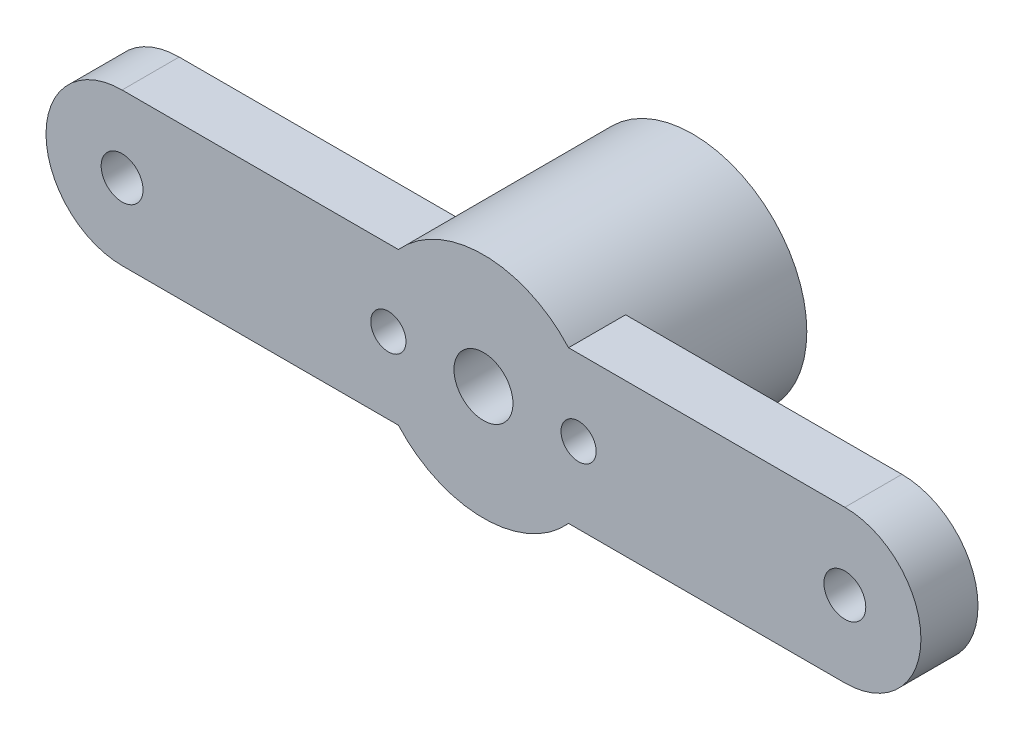
ISO-10303-21;
HEADER;
FILE_DESCRIPTION(('STEP AP214'),'2;1');
FILE_NAME('part.step','',(''),(''),'','','');
FILE_SCHEMA(('AUTOMOTIVE_DESIGN { 1 0 10303 214 1 1 1 1 }'));
ENDSEC;
DATA;
#1=APPLICATION_CONTEXT('core data for automotive mechanical design processes');
#2=APPLICATION_PROTOCOL_DEFINITION('international standard','automotive_design',2000,#1);
#3=PRODUCT_CONTEXT('',#1,'mechanical');
#4=PRODUCT('Part','Part','',(#3));
#5=PRODUCT_RELATED_PRODUCT_CATEGORY('part','',(#4));
#6=PRODUCT_DEFINITION_FORMATION('','',#4);
#7=PRODUCT_DEFINITION_CONTEXT('part definition',#1,'design');
#8=PRODUCT_DEFINITION('design','',#6,#7);
#9=PRODUCT_DEFINITION_SHAPE('','',#8);
#10=(LENGTH_UNIT() NAMED_UNIT(*) SI_UNIT(.MILLI.,.METRE.));
#11=(NAMED_UNIT(*) PLANE_ANGLE_UNIT() SI_UNIT($,.RADIAN.));
#12=(NAMED_UNIT(*) SI_UNIT($,.STERADIAN.) SOLID_ANGLE_UNIT());
#13=UNCERTAINTY_MEASURE_WITH_UNIT(LENGTH_MEASURE(1.E-05),#10,'distance_accuracy_value','');
#14=(GEOMETRIC_REPRESENTATION_CONTEXT(3) GLOBAL_UNCERTAINTY_ASSIGNED_CONTEXT((#13)) GLOBAL_UNIT_ASSIGNED_CONTEXT((#10,
#11,#12)) REPRESENTATION_CONTEXT('',''));
#15=CARTESIAN_POINT('',(0.,0.,0.));
#16=DIRECTION('',(0.,0.,1.));
#17=DIRECTION('',(1.,0.,0.));
#18=AXIS2_PLACEMENT_3D('',#15,#16,#17);
#19=CARTESIAN_POINT('',(-19.,0.,0.));
#20=DIRECTION('',(0.,0.,1.));
#21=DIRECTION('',(1.,0.,0.));
#22=AXIS2_PLACEMENT_3D('',#19,#20,#21);
#23=PLANE('',#22);
#24=CARTESIAN_POINT('',(0.,0.,0.));
#25=DIRECTION('',(0.,0.,-1.));
#26=DIRECTION('',(-1.,0.,0.));
#27=AXIS2_PLACEMENT_3D('',#24,#25,#26);
#28=CIRCLE('',#27,6.);
#29=CARTESIAN_POINT('',(4.47213595499958,4.,0.));
#30=VERTEX_POINT('',#29);
#31=CARTESIAN_POINT('',(4.47213595499958,-4.,0.));
#32=VERTEX_POINT('',#31);
#33=EDGE_CURVE('E11',#30,#32,#28,.T.);
#34=ORIENTED_EDGE('',*,*,#33,.F.);
#35=DIRECTION('',(-1.,0.,0.));
#36=VECTOR('',#35,1.);
#37=CARTESIAN_POINT('',(4.47213595499958,4.,0.));
#38=LINE('',#37,#36);
#39=CARTESIAN_POINT('',(19.,4.,0.));
#40=VERTEX_POINT('',#39);
#41=EDGE_CURVE('E127',#40,#30,#38,.T.);
#42=ORIENTED_EDGE('',*,*,#41,.F.);
#43=CARTESIAN_POINT('',(19.,0.,0.));
#44=DIRECTION('',(0.,0.,1.));
#45=DIRECTION('',(1.,0.,0.));
#46=AXIS2_PLACEMENT_3D('',#43,#44,#45);
#47=CIRCLE('',#46,4.);
#48=CARTESIAN_POINT('',(19.,-4.,0.));
#49=VERTEX_POINT('',#48);
#50=EDGE_CURVE('E144',#49,#40,#47,.T.);
#51=ORIENTED_EDGE('',*,*,#50,.F.);
#52=DIRECTION('',(1.,0.,0.));
#53=VECTOR('',#52,1.);
#54=CARTESIAN_POINT('',(4.47213595499958,-4.,0.));
#55=LINE('',#54,#53);
#56=EDGE_CURVE('E146',#32,#49,#55,.T.);
#57=ORIENTED_EDGE('',*,*,#56,.F.);
#58=EDGE_LOOP('',(#34,#42,#51,#57));
#59=FACE_BOUND('',#58,.T.);
#60=CARTESIAN_POINT('',(19.,0.,0.));
#61=DIRECTION('',(0.,0.,1.));
#62=DIRECTION('',(1.,0.,0.));
#63=AXIS2_PLACEMENT_3D('',#60,#61,#62);
#64=CIRCLE('',#63,1.1);
#65=CARTESIAN_POINT('',(20.1,0.,0.));
#66=VERTEX_POINT('',#65);
#67=EDGE_CURVE('E207',#66,#66,#64,.T.);
#68=ORIENTED_EDGE('',*,*,#67,.T.);
#69=EDGE_LOOP('',(#68));
#70=FACE_BOUND('',#69,.T.);
#71=ADVANCED_FACE('F37',(#59,#70),#23,.F.);
#72=CARTESIAN_POINT('',(-19.,0.,3.));
#73=DIRECTION('',(0.,0.,1.));
#74=DIRECTION('',(1.,0.,0.));
#75=AXIS2_PLACEMENT_3D('',#72,#73,#74);
#76=PLANE('',#75);
#77=CARTESIAN_POINT('',(-5.,0.,3.));
#78=DIRECTION('',(0.,0.,1.));
#79=DIRECTION('',(1.,0.,0.));
#80=AXIS2_PLACEMENT_3D('',#77,#78,#79);
#81=CIRCLE('',#80,0.925);
#82=CARTESIAN_POINT('',(-4.075,0.,3.));
#83=VERTEX_POINT('',#82);
#84=EDGE_CURVE('E218',#83,#83,#81,.T.);
#85=ORIENTED_EDGE('',*,*,#84,.F.);
#86=EDGE_LOOP('',(#85));
#87=FACE_BOUND('',#86,.T.);
#88=CARTESIAN_POINT('',(19.,0.,3.));
#89=DIRECTION('',(0.,0.,1.));
#90=DIRECTION('',(1.,0.,0.));
#91=AXIS2_PLACEMENT_3D('',#88,#89,#90);
#92=CIRCLE('',#91,1.1);
#93=CARTESIAN_POINT('',(20.1,0.,3.));
#94=VERTEX_POINT('',#93);
#95=EDGE_CURVE('E209',#94,#94,#92,.T.);
#96=ORIENTED_EDGE('',*,*,#95,.F.);
#97=EDGE_LOOP('',(#96));
#98=FACE_BOUND('',#97,.T.);
#99=CARTESIAN_POINT('',(-19.,0.,3.));
#100=DIRECTION('',(0.,0.,1.));
#101=DIRECTION('',(1.,0.,0.));
#102=AXIS2_PLACEMENT_3D('',#99,#100,#101);
#103=CIRCLE('',#102,4.);
#104=CARTESIAN_POINT('',(-19.,4.,3.));
#105=VERTEX_POINT('',#104);
#106=CARTESIAN_POINT('',(-19.,-4.,3.));
#107=VERTEX_POINT('',#106);
#108=EDGE_CURVE('E185',#105,#107,#103,.T.);
#109=ORIENTED_EDGE('',*,*,#108,.T.);
#110=DIRECTION('',(1.,0.,0.));
#111=VECTOR('',#110,1.);
#112=CARTESIAN_POINT('',(-19.,-4.,3.));
#113=LINE('',#112,#111);
#114=CARTESIAN_POINT('',(-4.47213595499958,-4.,3.));
#115=VERTEX_POINT('',#114);
#116=EDGE_CURVE('E97',#107,#115,#113,.T.);
#117=ORIENTED_EDGE('',*,*,#116,.T.);
#118=CARTESIAN_POINT('',(0.,0.,3.));
#119=DIRECTION('',(0.,0.,1.));
#120=DIRECTION('',(1.,0.,0.));
#121=AXIS2_PLACEMENT_3D('',#118,#119,#120);
#122=CIRCLE('',#121,6.);
#123=CARTESIAN_POINT('',(4.47213595499958,-4.,3.));
#124=VERTEX_POINT('',#123);
#125=EDGE_CURVE('E189',#115,#124,#122,.T.);
#126=ORIENTED_EDGE('',*,*,#125,.T.);
#127=DIRECTION('',(1.,0.,0.));
#128=VECTOR('',#127,1.);
#129=CARTESIAN_POINT('',(4.47213595499958,-4.,3.));
#130=LINE('',#129,#128);
#131=CARTESIAN_POINT('',(19.,-4.,3.));
#132=VERTEX_POINT('',#131);
#133=EDGE_CURVE('E195',#124,#132,#130,.T.);
#134=ORIENTED_EDGE('',*,*,#133,.T.);
#135=CARTESIAN_POINT('',(19.,0.,3.));
#136=DIRECTION('',(0.,0.,1.));
#137=DIRECTION('',(1.,0.,0.));
#138=AXIS2_PLACEMENT_3D('',#135,#136,#137);
#139=CIRCLE('',#138,4.);
#140=CARTESIAN_POINT('',(19.,4.,3.));
#141=VERTEX_POINT('',#140);
#142=EDGE_CURVE('E119',#132,#141,#139,.T.);
#143=ORIENTED_EDGE('',*,*,#142,.T.);
#144=DIRECTION('',(-1.,0.,0.));
#145=VECTOR('',#144,1.);
#146=CARTESIAN_POINT('',(4.47213595499958,4.,3.));
#147=LINE('',#146,#145);
#148=CARTESIAN_POINT('',(4.47213595499958,4.,3.));
#149=VERTEX_POINT('',#148);
#150=EDGE_CURVE('E111',#141,#149,#147,.T.);
#151=ORIENTED_EDGE('',*,*,#150,.T.);
#152=CARTESIAN_POINT('',(0.,0.,3.));
#153=DIRECTION('',(0.,0.,1.));
#154=DIRECTION('',(1.,0.,0.));
#155=AXIS2_PLACEMENT_3D('',#152,#153,#154);
#156=CIRCLE('',#155,6.);
#157=CARTESIAN_POINT('',(-4.47213595499958,4.,3.));
#158=VERTEX_POINT('',#157);
#159=EDGE_CURVE('E116',#149,#158,#156,.T.);
#160=ORIENTED_EDGE('',*,*,#159,.T.);
#161=DIRECTION('',(-1.,0.,0.));
#162=VECTOR('',#161,1.);
#163=CARTESIAN_POINT('',(-19.,4.,3.));
#164=LINE('',#163,#162);
#165=EDGE_CURVE('E56',#158,#105,#164,.T.);
#166=ORIENTED_EDGE('',*,*,#165,.T.);
#167=EDGE_LOOP('',(#109,#117,#126,#134,#143,#151,#160,#166));
#168=FACE_BOUND('',#167,.T.);
#169=CARTESIAN_POINT('',(0.,0.,3.));
#170=DIRECTION('',(0.,0.,1.));
#171=DIRECTION('',(1.,0.,0.));
#172=AXIS2_PLACEMENT_3D('',#169,#170,#171);
#173=CIRCLE('',#172,1.55);
#174=CARTESIAN_POINT('',(1.55,0.,3.));
#175=VERTEX_POINT('',#174);
#176=EDGE_CURVE('E143',#175,#175,#173,.T.);
#177=ORIENTED_EDGE('',*,*,#176,.F.);
#178=EDGE_LOOP('',(#177));
#179=FACE_BOUND('',#178,.T.);
#180=CARTESIAN_POINT('',(-19.,0.,3.));
#181=DIRECTION('',(0.,0.,1.));
#182=DIRECTION('',(1.,0.,0.));
#183=AXIS2_PLACEMENT_3D('',#180,#181,#182);
#184=CIRCLE('',#183,1.1);
#185=CARTESIAN_POINT('',(-17.9,0.,3.));
#186=VERTEX_POINT('',#185);
#187=EDGE_CURVE('E210',#186,#186,#184,.T.);
#188=ORIENTED_EDGE('',*,*,#187,.F.);
#189=EDGE_LOOP('',(#188));
#190=FACE_BOUND('',#189,.T.);
#191=CARTESIAN_POINT('',(5.,0.,3.));
#192=DIRECTION('',(0.,0.,1.));
#193=DIRECTION('',(1.,0.,0.));
#194=AXIS2_PLACEMENT_3D('',#191,#192,#193);
#195=CIRCLE('',#194,0.925);
#196=CARTESIAN_POINT('',(5.925,0.,3.));
#197=VERTEX_POINT('',#196);
#198=EDGE_CURVE('E222',#197,#197,#195,.T.);
#199=ORIENTED_EDGE('',*,*,#198,.F.);
#200=EDGE_LOOP('',(#199));
#201=FACE_BOUND('',#200,.T.);
#202=ADVANCED_FACE('F113',(#87,#98,#168,#179,#190,#201),#76,.T.);
#203=CARTESIAN_POINT('',(-4.47213595499958,-4.,0.));
#204=VERTEX_POINT('',#203);
#205=CARTESIAN_POINT('',(-4.47213595499958,4.,0.));
#206=VERTEX_POINT('',#205);
#207=EDGE_CURVE('E47',#204,#206,#28,.T.);
#208=ORIENTED_EDGE('',*,*,#207,.F.);
#209=DIRECTION('',(1.,0.,0.));
#210=VECTOR('',#209,1.);
#211=CARTESIAN_POINT('',(-19.,-4.,0.));
#212=LINE('',#211,#210);
#213=CARTESIAN_POINT('',(-19.,-4.,0.));
#214=VERTEX_POINT('',#213);
#215=EDGE_CURVE('E142',#214,#204,#212,.T.);
#216=ORIENTED_EDGE('',*,*,#215,.F.);
#217=CARTESIAN_POINT('',(-19.,0.,0.));
#218=DIRECTION('',(0.,0.,1.));
#219=DIRECTION('',(1.,0.,0.));
#220=AXIS2_PLACEMENT_3D('',#217,#218,#219);
#221=CIRCLE('',#220,4.);
#222=CARTESIAN_POINT('',(-19.,4.,0.));
#223=VERTEX_POINT('',#222);
#224=EDGE_CURVE('E139',#223,#214,#221,.T.);
#225=ORIENTED_EDGE('',*,*,#224,.F.);
#226=DIRECTION('',(-1.,0.,0.));
#227=VECTOR('',#226,1.);
#228=CARTESIAN_POINT('',(-19.,4.,0.));
#229=LINE('',#228,#227);
#230=EDGE_CURVE('E88',#206,#223,#229,.T.);
#231=ORIENTED_EDGE('',*,*,#230,.F.);
#232=EDGE_LOOP('',(#208,#216,#225,#231));
#233=FACE_BOUND('',#232,.T.);
#234=CARTESIAN_POINT('',(-19.,0.,0.));
#235=DIRECTION('',(0.,0.,1.));
#236=DIRECTION('',(1.,0.,0.));
#237=AXIS2_PLACEMENT_3D('',#234,#235,#236);
#238=CIRCLE('',#237,1.1);
#239=CARTESIAN_POINT('',(-17.9,0.,0.));
#240=VERTEX_POINT('',#239);
#241=EDGE_CURVE('E214',#240,#240,#238,.T.);
#242=ORIENTED_EDGE('',*,*,#241,.T.);
#243=EDGE_LOOP('',(#242));
#244=FACE_BOUND('',#243,.T.);
#245=ADVANCED_FACE('F204',(#233,#244),#23,.F.);
#246=CARTESIAN_POINT('',(-19.,0.,3.));
#247=DIRECTION('',(0.,0.,-1.));
#248=DIRECTION('',(-1.,0.,0.));
#249=AXIS2_PLACEMENT_3D('',#246,#247,#248);
#250=CYLINDRICAL_SURFACE('',#249,4.);
#251=ORIENTED_EDGE('',*,*,#224,.T.);
#252=DIRECTION('',(0.,0.,-1.));
#253=VECTOR('',#252,1.);
#254=CARTESIAN_POINT('',(-19.,-4.,3.));
#255=LINE('',#254,#253);
#256=EDGE_CURVE('E153',#107,#214,#255,.T.);
#257=ORIENTED_EDGE('',*,*,#256,.F.);
#258=ORIENTED_EDGE('',*,*,#108,.F.);
#259=DIRECTION('',(0.,0.,-1.));
#260=VECTOR('',#259,1.);
#261=CARTESIAN_POINT('',(-19.,4.,3.));
#262=LINE('',#261,#260);
#263=EDGE_CURVE('E135',#105,#223,#262,.T.);
#264=ORIENTED_EDGE('',*,*,#263,.T.);
#265=EDGE_LOOP('',(#251,#257,#258,#264));
#266=FACE_BOUND('',#265,.T.);
#267=ADVANCED_FACE('F39',(#266),#250,.T.);
#268=CARTESIAN_POINT('',(-19.,-4.,3.));
#269=DIRECTION('',(0.,1.,0.));
#270=DIRECTION('',(0.,0.,1.));
#271=AXIS2_PLACEMENT_3D('',#268,#269,#270);
#272=PLANE('',#271);
#273=ORIENTED_EDGE('',*,*,#215,.T.);
#274=DIRECTION('',(0.,0.,-1.));
#275=VECTOR('',#274,1.);
#276=CARTESIAN_POINT('',(-4.47213595499958,-4.,3.));
#277=LINE('',#276,#275);
#278=EDGE_CURVE('E155',#115,#204,#277,.T.);
#279=ORIENTED_EDGE('',*,*,#278,.F.);
#280=ORIENTED_EDGE('',*,*,#116,.F.);
#281=ORIENTED_EDGE('',*,*,#256,.T.);
#282=EDGE_LOOP('',(#273,#279,#280,#281));
#283=FACE_BOUND('',#282,.T.);
#284=ADVANCED_FACE('F283',(#283),#272,.F.);
#285=CARTESIAN_POINT('',(4.47213595499958,-4.,3.));
#286=DIRECTION('',(0.,1.,0.));
#287=DIRECTION('',(0.,0.,1.));
#288=AXIS2_PLACEMENT_3D('',#285,#286,#287);
#289=PLANE('',#288);
#290=ORIENTED_EDGE('',*,*,#56,.T.);
#291=DIRECTION('',(0.,0.,-1.));
#292=VECTOR('',#291,1.);
#293=CARTESIAN_POINT('',(19.,-4.,3.));
#294=LINE('',#293,#292);
#295=EDGE_CURVE('E149',#132,#49,#294,.T.);
#296=ORIENTED_EDGE('',*,*,#295,.F.);
#297=ORIENTED_EDGE('',*,*,#133,.F.);
#298=DIRECTION('',(0.,0.,-1.));
#299=VECTOR('',#298,1.);
#300=CARTESIAN_POINT('',(4.47213595499958,-4.,3.));
#301=LINE('',#300,#299);
#302=EDGE_CURVE('E152',#124,#32,#301,.T.);
#303=ORIENTED_EDGE('',*,*,#302,.T.);
#304=EDGE_LOOP('',(#290,#296,#297,#303));
#305=FACE_BOUND('',#304,.T.);
#306=ADVANCED_FACE('F197',(#305),#289,.F.);
#307=CARTESIAN_POINT('',(19.,0.,3.));
#308=DIRECTION('',(0.,0.,-1.));
#309=DIRECTION('',(-1.,0.,0.));
#310=AXIS2_PLACEMENT_3D('',#307,#308,#309);
#311=CYLINDRICAL_SURFACE('',#310,4.);
#312=ORIENTED_EDGE('',*,*,#50,.T.);
#313=DIRECTION('',(0.,0.,-1.));
#314=VECTOR('',#313,1.);
#315=CARTESIAN_POINT('',(19.,4.,3.));
#316=LINE('',#315,#314);
#317=EDGE_CURVE('E129',#141,#40,#316,.T.);
#318=ORIENTED_EDGE('',*,*,#317,.F.);
#319=ORIENTED_EDGE('',*,*,#142,.F.);
#320=ORIENTED_EDGE('',*,*,#295,.T.);
#321=EDGE_LOOP('',(#312,#318,#319,#320));
#322=FACE_BOUND('',#321,.T.);
#323=ADVANCED_FACE('F200',(#322),#311,.T.);
#324=CARTESIAN_POINT('',(4.47213595499958,4.,3.));
#325=DIRECTION('',(0.,-1.,0.));
#326=DIRECTION('',(1.,0.,0.));
#327=AXIS2_PLACEMENT_3D('',#324,#325,#326);
#328=PLANE('',#327);
#329=ORIENTED_EDGE('',*,*,#41,.T.);
#330=DIRECTION('',(0.,0.,-1.));
#331=VECTOR('',#330,1.);
#332=CARTESIAN_POINT('',(4.47213595499958,4.,3.));
#333=LINE('',#332,#331);
#334=EDGE_CURVE('E125',#149,#30,#333,.T.);
#335=ORIENTED_EDGE('',*,*,#334,.F.);
#336=ORIENTED_EDGE('',*,*,#150,.F.);
#337=ORIENTED_EDGE('',*,*,#317,.T.);
#338=EDGE_LOOP('',(#329,#335,#336,#337));
#339=FACE_BOUND('',#338,.T.);
#340=ADVANCED_FACE('F126',(#339),#328,.F.);
#341=CARTESIAN_POINT('',(0.,0.,3.));
#342=DIRECTION('',(0.,0.,-1.));
#343=DIRECTION('',(-1.,0.,0.));
#344=AXIS2_PLACEMENT_3D('',#341,#342,#343);
#345=CYLINDRICAL_SURFACE('',#344,6.);
#346=ORIENTED_EDGE('',*,*,#334,.T.);
#347=ORIENTED_EDGE('',*,*,#33,.T.);
#348=ORIENTED_EDGE('',*,*,#302,.F.);
#349=ORIENTED_EDGE('',*,*,#125,.F.);
#350=ORIENTED_EDGE('',*,*,#278,.T.);
#351=ORIENTED_EDGE('',*,*,#207,.T.);
#352=DIRECTION('',(0.,0.,-1.));
#353=VECTOR('',#352,1.);
#354=CARTESIAN_POINT('',(-4.47213595499958,4.,3.));
#355=LINE('',#354,#353);
#356=EDGE_CURVE('E130',#158,#206,#355,.T.);
#357=ORIENTED_EDGE('',*,*,#356,.F.);
#358=ORIENTED_EDGE('',*,*,#159,.F.);
#359=EDGE_LOOP('',(#346,#347,#348,#349,#350,#351,#357,#358));
#360=FACE_BOUND('',#359,.T.);
#361=CARTESIAN_POINT('',(0.,0.,-8.));
#362=DIRECTION('',(0.,0.,-1.));
#363=DIRECTION('',(-1.,0.,0.));
#364=AXIS2_PLACEMENT_3D('',#361,#362,#363);
#365=CIRCLE('',#364,6.);
#366=CARTESIAN_POINT('',(-6.,0.,-8.));
#367=VERTEX_POINT('',#366);
#368=EDGE_CURVE('E225',#367,#367,#365,.T.);
#369=ORIENTED_EDGE('',*,*,#368,.F.);
#370=EDGE_LOOP('',(#369));
#371=FACE_BOUND('',#370,.T.);
#372=ADVANCED_FACE('F131',(#360,#371),#345,.T.);
#373=CARTESIAN_POINT('',(-19.,4.,3.));
#374=DIRECTION('',(0.,-1.,0.));
#375=DIRECTION('',(0.,0.,-1.));
#376=AXIS2_PLACEMENT_3D('',#373,#374,#375);
#377=PLANE('',#376);
#378=ORIENTED_EDGE('',*,*,#230,.T.);
#379=ORIENTED_EDGE('',*,*,#263,.F.);
#380=ORIENTED_EDGE('',*,*,#165,.F.);
#381=ORIENTED_EDGE('',*,*,#356,.T.);
#382=EDGE_LOOP('',(#378,#379,#380,#381));
#383=FACE_BOUND('',#382,.T.);
#384=ADVANCED_FACE('F267',(#383),#377,.F.);
#385=CARTESIAN_POINT('',(0.,0.,3.));
#386=DIRECTION('',(0.,0.,-1.));
#387=DIRECTION('',(-1.,0.,0.));
#388=AXIS2_PLACEMENT_3D('',#385,#386,#387);
#389=CYLINDRICAL_SURFACE('',#388,1.55);
#390=ORIENTED_EDGE('',*,*,#176,.T.);
#391=EDGE_LOOP('',(#390));
#392=FACE_BOUND('',#391,.T.);
#393=CARTESIAN_POINT('',(0.,0.,-8.));
#394=DIRECTION('',(0.,0.,-1.));
#395=DIRECTION('',(-1.,0.,0.));
#396=AXIS2_PLACEMENT_3D('',#393,#394,#395);
#397=CIRCLE('',#396,1.55);
#398=CARTESIAN_POINT('',(-1.55,0.,-8.));
#399=VERTEX_POINT('',#398);
#400=EDGE_CURVE('E228',#399,#399,#397,.T.);
#401=ORIENTED_EDGE('',*,*,#400,.T.);
#402=EDGE_LOOP('',(#401));
#403=FACE_BOUND('',#402,.T.);
#404=ADVANCED_FACE('F263',(#392,#403),#389,.F.);
#405=CARTESIAN_POINT('',(19.,0.,3.));
#406=DIRECTION('',(0.,0.,-1.));
#407=DIRECTION('',(-1.,0.,0.));
#408=AXIS2_PLACEMENT_3D('',#405,#406,#407);
#409=CYLINDRICAL_SURFACE('',#408,1.1);
#410=ORIENTED_EDGE('',*,*,#95,.T.);
#411=EDGE_LOOP('',(#410));
#412=FACE_BOUND('',#411,.T.);
#413=ORIENTED_EDGE('',*,*,#67,.F.);
#414=EDGE_LOOP('',(#413));
#415=FACE_BOUND('',#414,.T.);
#416=ADVANCED_FACE('F259',(#412,#415),#409,.F.);
#417=CARTESIAN_POINT('',(-19.,0.,3.));
#418=DIRECTION('',(0.,0.,-1.));
#419=DIRECTION('',(-1.,0.,0.));
#420=AXIS2_PLACEMENT_3D('',#417,#418,#419);
#421=CYLINDRICAL_SURFACE('',#420,1.1);
#422=ORIENTED_EDGE('',*,*,#187,.T.);
#423=EDGE_LOOP('',(#422));
#424=FACE_BOUND('',#423,.T.);
#425=ORIENTED_EDGE('',*,*,#241,.F.);
#426=EDGE_LOOP('',(#425));
#427=FACE_BOUND('',#426,.T.);
#428=ADVANCED_FACE('F255',(#424,#427),#421,.F.);
#429=CARTESIAN_POINT('',(-5.,0.,3.));
#430=DIRECTION('',(0.,0.,-1.));
#431=DIRECTION('',(-1.,0.,0.));
#432=AXIS2_PLACEMENT_3D('',#429,#430,#431);
#433=CYLINDRICAL_SURFACE('',#432,0.925);
#434=ORIENTED_EDGE('',*,*,#84,.T.);
#435=EDGE_LOOP('',(#434));
#436=FACE_BOUND('',#435,.T.);
#437=CARTESIAN_POINT('',(-5.,0.,-8.));
#438=DIRECTION('',(0.,0.,-1.));
#439=DIRECTION('',(-1.,0.,0.));
#440=AXIS2_PLACEMENT_3D('',#437,#438,#439);
#441=CIRCLE('',#440,0.925);
#442=CARTESIAN_POINT('',(-5.925,0.,-8.));
#443=VERTEX_POINT('',#442);
#444=EDGE_CURVE('E234',#443,#443,#441,.T.);
#445=ORIENTED_EDGE('',*,*,#444,.T.);
#446=EDGE_LOOP('',(#445));
#447=FACE_BOUND('',#446,.T.);
#448=ADVANCED_FACE('F238',(#436,#447),#433,.F.);
#449=CARTESIAN_POINT('',(5.,0.,3.));
#450=DIRECTION('',(0.,0.,-1.));
#451=DIRECTION('',(-1.,0.,0.));
#452=AXIS2_PLACEMENT_3D('',#449,#450,#451);
#453=CYLINDRICAL_SURFACE('',#452,0.925);
#454=ORIENTED_EDGE('',*,*,#198,.T.);
#455=EDGE_LOOP('',(#454));
#456=FACE_BOUND('',#455,.T.);
#457=CARTESIAN_POINT('',(5.,0.,-8.));
#458=DIRECTION('',(0.,0.,-1.));
#459=DIRECTION('',(-1.,0.,0.));
#460=AXIS2_PLACEMENT_3D('',#457,#458,#459);
#461=CIRCLE('',#460,0.925);
#462=CARTESIAN_POINT('',(4.075,0.,-8.));
#463=VERTEX_POINT('',#462);
#464=EDGE_CURVE('E231',#463,#463,#461,.T.);
#465=ORIENTED_EDGE('',*,*,#464,.T.);
#466=EDGE_LOOP('',(#465));
#467=FACE_BOUND('',#466,.T.);
#468=ADVANCED_FACE('F242',(#456,#467),#453,.F.);
#469=CARTESIAN_POINT('',(0.,0.,-8.));
#470=DIRECTION('',(0.,0.,-1.));
#471=DIRECTION('',(-1.,0.,0.));
#472=AXIS2_PLACEMENT_3D('',#469,#470,#471);
#473=PLANE('',#472);
#474=ORIENTED_EDGE('',*,*,#464,.F.);
#475=EDGE_LOOP('',(#474));
#476=FACE_BOUND('',#475,.T.);
#477=ORIENTED_EDGE('',*,*,#368,.T.);
#478=EDGE_LOOP('',(#477));
#479=FACE_BOUND('',#478,.T.);
#480=ORIENTED_EDGE('',*,*,#400,.F.);
#481=EDGE_LOOP('',(#480));
#482=FACE_BOUND('',#481,.T.);
#483=ORIENTED_EDGE('',*,*,#444,.F.);
#484=EDGE_LOOP('',(#483));
#485=FACE_BOUND('',#484,.T.);
#486=ADVANCED_FACE('F240',(#476,#479,#482,#485),#473,.T.);
#487=CLOSED_SHELL('',(#71,#202,#245,#267,#284,#306,#323,#340,#372,#384,#404,#416,#428,#448,#468,#486));
#488=MANIFOLD_SOLID_BREP('B2',#487);
#489=ADVANCED_BREP_SHAPE_REPRESENTATION('',(#18,#488),#14);
#490=SHAPE_DEFINITION_REPRESENTATION(#9,#489);
ENDSEC;
END-ISO-10303-21;
